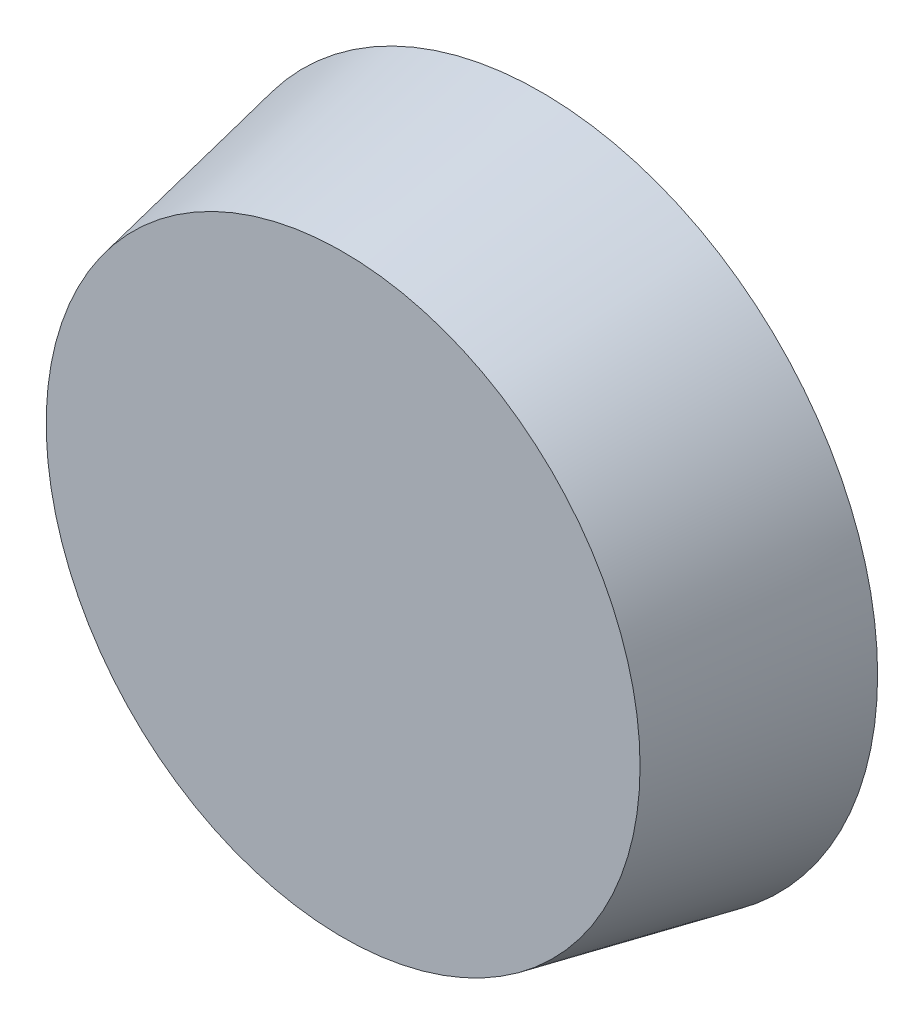
ISO-10303-21;
HEADER;
FILE_DESCRIPTION(('STEP AP214'),'2;1');
FILE_NAME('part.step','',(''),(''),'','','');
FILE_SCHEMA(('AUTOMOTIVE_DESIGN { 1 0 10303 214 1 1 1 1 }'));
ENDSEC;
DATA;
#1=APPLICATION_CONTEXT('core data for automotive mechanical design processes');
#2=APPLICATION_PROTOCOL_DEFINITION('international standard','automotive_design',2000,#1);
#3=PRODUCT_CONTEXT('',#1,'mechanical');
#4=PRODUCT('Part','Part','',(#3));
#5=PRODUCT_RELATED_PRODUCT_CATEGORY('part','',(#4));
#6=PRODUCT_DEFINITION_FORMATION('','',#4);
#7=PRODUCT_DEFINITION_CONTEXT('part definition',#1,'design');
#8=PRODUCT_DEFINITION('design','',#6,#7);
#9=PRODUCT_DEFINITION_SHAPE('','',#8);
#10=(LENGTH_UNIT() NAMED_UNIT(*) SI_UNIT(.MILLI.,.METRE.));
#11=(NAMED_UNIT(*) PLANE_ANGLE_UNIT() SI_UNIT($,.RADIAN.));
#12=(NAMED_UNIT(*) SI_UNIT($,.STERADIAN.) SOLID_ANGLE_UNIT());
#13=UNCERTAINTY_MEASURE_WITH_UNIT(LENGTH_MEASURE(1.E-05),#10,'distance_accuracy_value','');
#14=(GEOMETRIC_REPRESENTATION_CONTEXT(3) GLOBAL_UNCERTAINTY_ASSIGNED_CONTEXT((#13)) GLOBAL_UNIT_ASSIGNED_CONTEXT((#10,
#11,#12)) REPRESENTATION_CONTEXT('',''));
#15=CARTESIAN_POINT('',(0.,0.,0.));
#16=DIRECTION('',(0.,0.,1.));
#17=DIRECTION('',(1.,0.,0.));
#18=AXIS2_PLACEMENT_3D('',#15,#16,#17);
#19=CARTESIAN_POINT('',(0.,0.,31.75));
#20=DIRECTION('',(0.,0.,1.));
#21=DIRECTION('',(1.,0.,0.));
#22=AXIS2_PLACEMENT_3D('',#19,#20,#21);
#23=PLANE('',#22);
#24=CARTESIAN_POINT('',(0.,0.,31.75));
#25=DIRECTION('',(0.,0.,1.));
#26=DIRECTION('',(1.,0.,0.));
#27=AXIS2_PLACEMENT_3D('',#24,#25,#26);
#28=CIRCLE('',#27,47.625);
#29=CARTESIAN_POINT('',(47.625,0.,31.75));
#30=VERTEX_POINT('',#29);
#31=EDGE_CURVE('E11',#30,#30,#28,.T.);
#32=ORIENTED_EDGE('',*,*,#31,.T.);
#33=EDGE_LOOP('',(#32));
#34=FACE_BOUND('',#33,.T.);
#35=ADVANCED_FACE('F43',(#34),#23,.T.);
#36=CARTESIAN_POINT('',(0.,0.,0.));
#37=DIRECTION('',(0.,0.,1.));
#38=DIRECTION('',(1.,0.,0.));
#39=AXIS2_PLACEMENT_3D('',#36,#37,#38);
#40=PLANE('',#39);
#41=CARTESIAN_POINT('',(0.,0.,0.));
#42=DIRECTION('',(0.,0.,1.));
#43=DIRECTION('',(1.,0.,0.));
#44=AXIS2_PLACEMENT_3D('',#41,#42,#43);
#45=CIRCLE('',#44,53.975);
#46=CARTESIAN_POINT('',(53.975,0.,0.));
#47=VERTEX_POINT('',#46);
#48=EDGE_CURVE('E52',#47,#47,#45,.T.);
#49=ORIENTED_EDGE('',*,*,#48,.F.);
#50=EDGE_LOOP('',(#49));
#51=FACE_BOUND('',#50,.T.);
#52=ADVANCED_FACE('F76',(#51),#40,.F.);
#53=CARTESIAN_POINT('',(0.,0.,31.75));
#54=DIRECTION('',(0.,0.,-1.));
#55=DIRECTION('',(-1.,0.,0.));
#56=AXIS2_PLACEMENT_3D('',#53,#54,#55);
#57=CONICAL_SURFACE('',#56,47.625,0.197395559849881);
#58=ORIENTED_EDGE('',*,*,#48,.T.);
#59=EDGE_LOOP('',(#58));
#60=FACE_BOUND('',#59,.T.);
#61=ORIENTED_EDGE('',*,*,#31,.F.);
#62=EDGE_LOOP('',(#61));
#63=FACE_BOUND('',#62,.T.);
#64=ADVANCED_FACE('F84',(#60,#63),#57,.T.);
#65=CLOSED_SHELL('',(#35,#52,#64));
#66=MANIFOLD_SOLID_BREP('B2',#65);
#67=ADVANCED_BREP_SHAPE_REPRESENTATION('',(#18,#66),#14);
#68=SHAPE_DEFINITION_REPRESENTATION(#9,#67);
ENDSEC;
END-ISO-10303-21;
